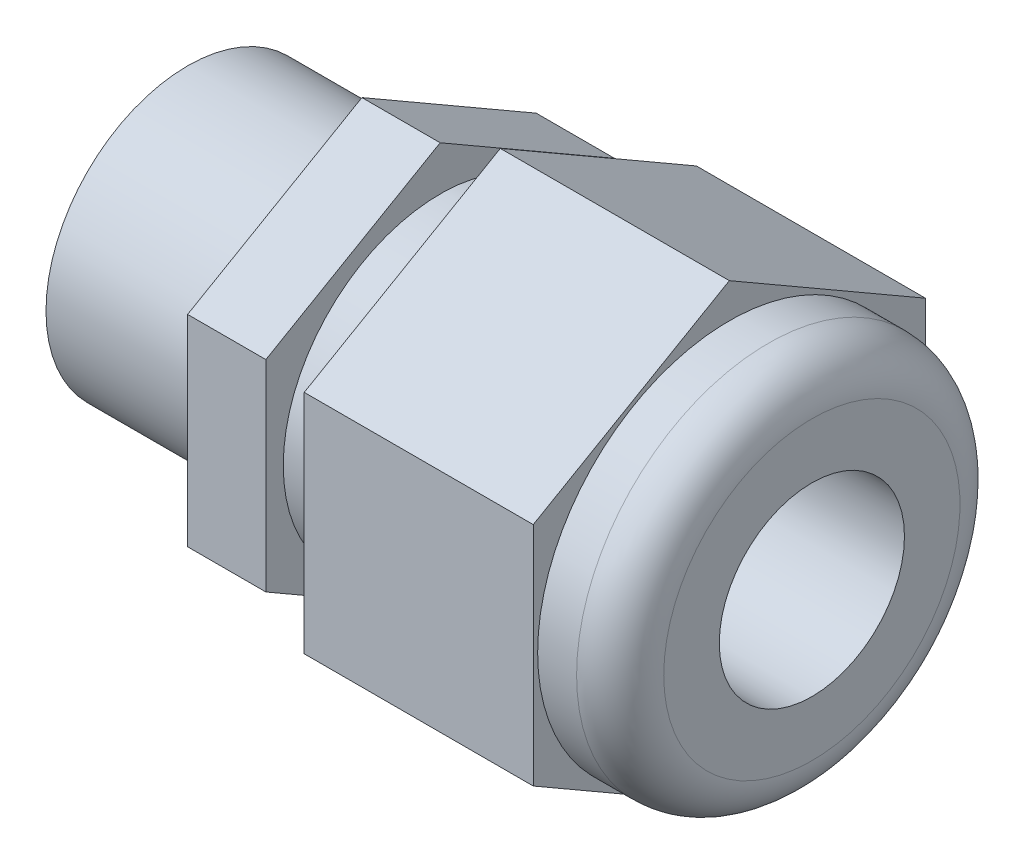
ISO-10303-21;
HEADER;
FILE_DESCRIPTION(('STEP AP214'),'2;1');
FILE_NAME('part.step','',(''),(''),'','','');
FILE_SCHEMA(('AUTOMOTIVE_DESIGN { 1 0 10303 214 1 1 1 1 }'));
ENDSEC;
DATA;
#1=APPLICATION_CONTEXT('core data for automotive mechanical design processes');
#2=APPLICATION_PROTOCOL_DEFINITION('international standard','automotive_design',2000,#1);
#3=PRODUCT_CONTEXT('',#1,'mechanical');
#4=PRODUCT('Part','Part','',(#3));
#5=PRODUCT_RELATED_PRODUCT_CATEGORY('part','',(#4));
#6=PRODUCT_DEFINITION_FORMATION('','',#4);
#7=PRODUCT_DEFINITION_CONTEXT('part definition',#1,'design');
#8=PRODUCT_DEFINITION('design','',#6,#7);
#9=PRODUCT_DEFINITION_SHAPE('','',#8);
#10=(LENGTH_UNIT() NAMED_UNIT(*) SI_UNIT(.MILLI.,.METRE.));
#11=(NAMED_UNIT(*) PLANE_ANGLE_UNIT() SI_UNIT($,.RADIAN.));
#12=(NAMED_UNIT(*) SI_UNIT($,.STERADIAN.) SOLID_ANGLE_UNIT());
#13=UNCERTAINTY_MEASURE_WITH_UNIT(LENGTH_MEASURE(1.E-05),#10,'distance_accuracy_value','');
#14=(GEOMETRIC_REPRESENTATION_CONTEXT(3) GLOBAL_UNCERTAINTY_ASSIGNED_CONTEXT((#13)) GLOBAL_UNIT_ASSIGNED_CONTEXT((#10,
#11,#12)) REPRESENTATION_CONTEXT('',''));
#15=CARTESIAN_POINT('',(0.,0.,0.));
#16=DIRECTION('',(0.,0.,1.));
#17=DIRECTION('',(1.,0.,0.));
#18=AXIS2_PLACEMENT_3D('',#15,#16,#17);
#19=CARTESIAN_POINT('',(11.5918104768105,7.20220565969389,0.));
#20=DIRECTION('',(-1.,0.,0.));
#21=DIRECTION('',(0.,0.,1.));
#22=AXIS2_PLACEMENT_3D('',#19,#20,#21);
#23=PLANE('',#22);
#24=CARTESIAN_POINT('',(11.5918104768105,0.,0.));
#25=DIRECTION('',(-1.,0.,0.));
#26=DIRECTION('',(0.,0.,1.));
#27=AXIS2_PLACEMENT_3D('',#24,#25,#26);
#28=CIRCLE('',#27,7.20220565969389);
#29=CARTESIAN_POINT('',(11.5918104768105,0.,7.20220565969389));
#30=VERTEX_POINT('',#29);
#31=EDGE_CURVE('E214',#30,#30,#28,.T.);
#32=ORIENTED_EDGE('',*,*,#31,.T.);
#33=EDGE_LOOP('',(#32));
#34=FACE_BOUND('',#33,.T.);
#35=DIRECTION('',(0.,0.5,-0.866025403784439));
#36=VECTOR('',#35,1.);
#37=CARTESIAN_POINT('',(11.5918104768105,8.72875464519898,0.881353467712515));
#38=LINE('',#37,#36);
#39=CARTESIAN_POINT('',(11.5918104768105,4.61880215351701,8.));
#40=VERTEX_POINT('',#39);
#41=CARTESIAN_POINT('',(11.5918104768105,9.23760430703402,0.));
#42=VERTEX_POINT('',#41);
#43=EDGE_CURVE('E175',#40,#42,#38,.T.);
#44=ORIENTED_EDGE('',*,*,#43,.F.);
#45=DIRECTION('',(0.,1.,0.));
#46=VECTOR('',#45,1.);
#47=CARTESIAN_POINT('',(11.5918104768105,7.20220565969389,8.));
#48=LINE('',#47,#46);
#49=CARTESIAN_POINT('',(11.5918104768105,-4.61880215351701,8.));
#50=VERTEX_POINT('',#49);
#51=EDGE_CURVE('E173',#50,#40,#48,.T.);
#52=ORIENTED_EDGE('',*,*,#51,.F.);
#53=DIRECTION('',(0.,0.5,0.866025403784439));
#54=VECTOR('',#53,1.);
#55=CARTESIAN_POINT('',(11.5918104768105,-5.12765181535204,7.11864653228749));
#56=LINE('',#55,#54);
#57=CARTESIAN_POINT('',(11.5918104768105,-9.23760430703401,0.));
#58=VERTEX_POINT('',#57);
#59=EDGE_CURVE('E171',#58,#50,#56,.T.);
#60=ORIENTED_EDGE('',*,*,#59,.F.);
#61=DIRECTION('',(0.,-0.5,0.866025403784439));
#62=VECTOR('',#61,1.);
#63=CARTESIAN_POINT('',(11.5918104768105,-5.12765181535203,-7.11864653228748));
#64=LINE('',#63,#62);
#65=CARTESIAN_POINT('',(11.5918104768105,-4.618802153517,-8.));
#66=VERTEX_POINT('',#65);
#67=EDGE_CURVE('E169',#66,#58,#64,.T.);
#68=ORIENTED_EDGE('',*,*,#67,.F.);
#69=DIRECTION('',(0.,-1.,0.));
#70=VECTOR('',#69,1.);
#71=CARTESIAN_POINT('',(11.5918104768105,7.20220565969389,-8.));
#72=LINE('',#71,#70);
#73=CARTESIAN_POINT('',(11.5918104768105,4.61880215351701,-8.));
#74=VERTEX_POINT('',#73);
#75=EDGE_CURVE('E131',#74,#66,#72,.T.);
#76=ORIENTED_EDGE('',*,*,#75,.F.);
#77=DIRECTION('',(0.,-0.5,-0.866025403784439));
#78=VECTOR('',#77,1.);
#79=CARTESIAN_POINT('',(11.5918104768105,8.72875464519898,-0.881353467712514));
#80=LINE('',#79,#78);
#81=EDGE_CURVE('E161',#42,#74,#80,.T.);
#82=ORIENTED_EDGE('',*,*,#81,.F.);
#83=EDGE_LOOP('',(#44,#52,#60,#68,#76,#82));
#84=FACE_BOUND('',#83,.T.);
#85=ADVANCED_FACE('F39',(#34,#84),#23,.F.);
#86=CARTESIAN_POINT('',(8.,10.,0.));
#87=DIRECTION('',(1.,0.,0.));
#88=DIRECTION('',(0.,0.,-1.));
#89=AXIS2_PLACEMENT_3D('',#86,#87,#88);
#90=PLANE('',#89);
#91=CARTESIAN_POINT('',(8.,0.,0.));
#92=DIRECTION('',(-1.,0.,0.));
#93=DIRECTION('',(0.,0.,1.));
#94=AXIS2_PLACEMENT_3D('',#91,#92,#93);
#95=CIRCLE('',#94,6.5);
#96=CARTESIAN_POINT('',(8.,0.,6.5));
#97=VERTEX_POINT('',#96);
#98=EDGE_CURVE('E211',#97,#97,#95,.T.);
#99=ORIENTED_EDGE('',*,*,#98,.F.);
#100=EDGE_LOOP('',(#99));
#101=FACE_BOUND('',#100,.T.);
#102=DIRECTION('',(0.,0.5,-0.866025403784439));
#103=VECTOR('',#102,1.);
#104=CARTESIAN_POINT('',(8.,4.61880215351701,8.));
#105=LINE('',#104,#103);
#106=CARTESIAN_POINT('',(8.,4.61880215351701,8.));
#107=VERTEX_POINT('',#106);
#108=CARTESIAN_POINT('',(8.,9.23760430703401,0.));
#109=VERTEX_POINT('',#108);
#110=EDGE_CURVE('E151',#107,#109,#105,.T.);
#111=ORIENTED_EDGE('',*,*,#110,.T.);
#112=DIRECTION('',(0.,-0.5,-0.866025403784439));
#113=VECTOR('',#112,1.);
#114=CARTESIAN_POINT('',(8.,9.23760430703402,0.));
#115=LINE('',#114,#113);
#116=CARTESIAN_POINT('',(8.,4.61880215351701,-8.));
#117=VERTEX_POINT('',#116);
#118=EDGE_CURVE('E149',#109,#117,#115,.T.);
#119=ORIENTED_EDGE('',*,*,#118,.T.);
#120=DIRECTION('',(0.,-1.,0.));
#121=VECTOR('',#120,1.);
#122=CARTESIAN_POINT('',(8.,4.61880215351701,-8.));
#123=LINE('',#122,#121);
#124=CARTESIAN_POINT('',(8.,-4.618802153517,-8.));
#125=VERTEX_POINT('',#124);
#126=EDGE_CURVE('E62',#117,#125,#123,.T.);
#127=ORIENTED_EDGE('',*,*,#126,.T.);
#128=DIRECTION('',(0.,-0.5,0.866025403784439));
#129=VECTOR('',#128,1.);
#130=CARTESIAN_POINT('',(8.,-4.618802153517,-8.));
#131=LINE('',#130,#129);
#132=CARTESIAN_POINT('',(8.,-9.23760430703401,0.));
#133=VERTEX_POINT('',#132);
#134=EDGE_CURVE('E138',#125,#133,#131,.T.);
#135=ORIENTED_EDGE('',*,*,#134,.T.);
#136=DIRECTION('',(0.,0.5,0.866025403784439));
#137=VECTOR('',#136,1.);
#138=CARTESIAN_POINT('',(8.,-9.23760430703401,0.));
#139=LINE('',#138,#137);
#140=CARTESIAN_POINT('',(8.,-4.61880215351701,8.));
#141=VERTEX_POINT('',#140);
#142=EDGE_CURVE('E144',#133,#141,#139,.T.);
#143=ORIENTED_EDGE('',*,*,#142,.T.);
#144=DIRECTION('',(0.,1.,0.));
#145=VECTOR('',#144,1.);
#146=CARTESIAN_POINT('',(8.,-4.61880215351701,8.));
#147=LINE('',#146,#145);
#148=EDGE_CURVE('E156',#141,#107,#147,.T.);
#149=ORIENTED_EDGE('',*,*,#148,.T.);
#150=EDGE_LOOP('',(#111,#119,#127,#135,#143,#149));
#151=FACE_BOUND('',#150,.T.);
#152=ADVANCED_FACE('F148',(#101,#151),#90,.F.);
#153=CARTESIAN_POINT('',(24.8644432748101,8.79866584697549,0.));
#154=DIRECTION('',(-1.,0.,0.));
#155=DIRECTION('',(0.,0.,1.));
#156=AXIS2_PLACEMENT_3D('',#153,#154,#155);
#157=PLANE('',#156);
#158=CARTESIAN_POINT('',(24.8644432748101,0.,0.));
#159=DIRECTION('',(-1.,0.,0.));
#160=DIRECTION('',(0.,0.,1.));
#161=AXIS2_PLACEMENT_3D('',#158,#159,#160);
#162=CIRCLE('',#161,8.79866584697549);
#163=CARTESIAN_POINT('',(24.8644432748101,0.,8.79866584697549));
#164=VERTEX_POINT('',#163);
#165=EDGE_CURVE('E220',#164,#164,#162,.T.);
#166=ORIENTED_EDGE('',*,*,#165,.T.);
#167=EDGE_LOOP('',(#166));
#168=FACE_BOUND('',#167,.T.);
#169=DIRECTION('',(0.,0.5,0.866025403784439));
#170=VECTOR('',#169,1.);
#171=CARTESIAN_POINT('',(24.8644432748101,5.19615242270664,-9.));
#172=LINE('',#171,#170);
#173=CARTESIAN_POINT('',(24.8644432748101,5.19615242270664,-9.));
#174=VERTEX_POINT('',#173);
#175=CARTESIAN_POINT('',(24.8644432748101,10.3923048454133,0.));
#176=VERTEX_POINT('',#175);
#177=EDGE_CURVE('E177',#174,#176,#172,.T.);
#178=ORIENTED_EDGE('',*,*,#177,.T.);
#179=DIRECTION('',(0.,-0.5,0.866025403784439));
#180=VECTOR('',#179,1.);
#181=CARTESIAN_POINT('',(24.8644432748101,10.3923048454133,0.));
#182=LINE('',#181,#180);
#183=CARTESIAN_POINT('',(24.8644432748101,5.19615242270663,9.));
#184=VERTEX_POINT('',#183);
#185=EDGE_CURVE('E180',#176,#184,#182,.T.);
#186=ORIENTED_EDGE('',*,*,#185,.T.);
#187=DIRECTION('',(0.,-1.,0.));
#188=VECTOR('',#187,1.);
#189=CARTESIAN_POINT('',(24.8644432748101,5.19615242270663,9.));
#190=LINE('',#189,#188);
#191=CARTESIAN_POINT('',(24.8644432748101,-5.19615242270663,9.));
#192=VERTEX_POINT('',#191);
#193=EDGE_CURVE('E183',#184,#192,#190,.T.);
#194=ORIENTED_EDGE('',*,*,#193,.T.);
#195=DIRECTION('',(0.,-0.5,-0.866025403784439));
#196=VECTOR('',#195,1.);
#197=CARTESIAN_POINT('',(24.8644432748101,-5.19615242270663,9.));
#198=LINE('',#197,#196);
#199=CARTESIAN_POINT('',(24.8644432748101,-10.3923048454133,0.));
#200=VERTEX_POINT('',#199);
#201=EDGE_CURVE('E186',#192,#200,#198,.T.);
#202=ORIENTED_EDGE('',*,*,#201,.T.);
#203=DIRECTION('',(0.,0.5,-0.866025403784439));
#204=VECTOR('',#203,1.);
#205=CARTESIAN_POINT('',(24.8644432748101,-10.3923048454133,0.));
#206=LINE('',#205,#204);
#207=CARTESIAN_POINT('',(24.8644432748101,-5.19615242270663,-9.));
#208=VERTEX_POINT('',#207);
#209=EDGE_CURVE('E189',#200,#208,#206,.T.);
#210=ORIENTED_EDGE('',*,*,#209,.T.);
#211=DIRECTION('',(0.,1.,0.));
#212=VECTOR('',#211,1.);
#213=CARTESIAN_POINT('',(24.8644432748101,-5.19615242270663,-9.));
#214=LINE('',#213,#212);
#215=EDGE_CURVE('E192',#208,#174,#214,.T.);
#216=ORIENTED_EDGE('',*,*,#215,.T.);
#217=EDGE_LOOP('',(#178,#186,#194,#202,#210,#216));
#218=FACE_BOUND('',#217,.T.);
#219=ADVANCED_FACE('F263',(#168,#218),#157,.F.);
#220=CARTESIAN_POINT('',(14.3525060344133,11.,0.));
#221=DIRECTION('',(1.,0.,0.));
#222=DIRECTION('',(0.,0.,-1.));
#223=AXIS2_PLACEMENT_3D('',#220,#221,#222);
#224=PLANE('',#223);
#225=CARTESIAN_POINT('',(14.3525060344133,0.,0.));
#226=DIRECTION('',(-1.,0.,0.));
#227=DIRECTION('',(0.,0.,1.));
#228=AXIS2_PLACEMENT_3D('',#225,#226,#227);
#229=CIRCLE('',#228,7.20220565969389);
#230=CARTESIAN_POINT('',(14.3525060344133,0.,7.20220565969389));
#231=VERTEX_POINT('',#230);
#232=EDGE_CURVE('E217',#231,#231,#229,.T.);
#233=ORIENTED_EDGE('',*,*,#232,.F.);
#234=EDGE_LOOP('',(#233));
#235=FACE_BOUND('',#234,.T.);
#236=DIRECTION('',(0.,0.5,0.866025403784439));
#237=VECTOR('',#236,1.);
#238=CARTESIAN_POINT('',(14.3525060344133,10.5442286340599,0.263139720814412));
#239=LINE('',#238,#237);
#240=CARTESIAN_POINT('',(14.3525060344133,5.19615242270664,-9.));
#241=VERTEX_POINT('',#240);
#242=CARTESIAN_POINT('',(14.3525060344133,10.3923048454133,0.));
#243=VERTEX_POINT('',#242);
#244=EDGE_CURVE('E239',#241,#243,#239,.T.);
#245=ORIENTED_EDGE('',*,*,#244,.F.);
#246=DIRECTION('',(0.,1.,0.));
#247=VECTOR('',#246,1.);
#248=CARTESIAN_POINT('',(14.3525060344133,11.,-9.));
#249=LINE('',#248,#247);
#250=CARTESIAN_POINT('',(14.3525060344133,-5.19615242270663,-9.));
#251=VERTEX_POINT('',#250);
#252=EDGE_CURVE('E237',#251,#241,#249,.T.);
#253=ORIENTED_EDGE('',*,*,#252,.F.);
#254=DIRECTION('',(0.,0.5,-0.866025403784439));
#255=VECTOR('',#254,1.);
#256=CARTESIAN_POINT('',(14.3525060344133,-5.04422863405995,-9.26313972081441));
#257=LINE('',#256,#255);
#258=CARTESIAN_POINT('',(14.3525060344133,-10.3923048454133,0.));
#259=VERTEX_POINT('',#258);
#260=EDGE_CURVE('E235',#259,#251,#257,.T.);
#261=ORIENTED_EDGE('',*,*,#260,.F.);
#262=DIRECTION('',(0.,-0.5,-0.866025403784439));
#263=VECTOR('',#262,1.);
#264=CARTESIAN_POINT('',(14.3525060344133,-5.04422863405995,9.26313972081441));
#265=LINE('',#264,#263);
#266=CARTESIAN_POINT('',(14.3525060344133,-5.19615242270663,9.));
#267=VERTEX_POINT('',#266);
#268=EDGE_CURVE('E233',#267,#259,#265,.T.);
#269=ORIENTED_EDGE('',*,*,#268,.F.);
#270=DIRECTION('',(0.,-1.,0.));
#271=VECTOR('',#270,1.);
#272=CARTESIAN_POINT('',(14.3525060344133,11.,9.));
#273=LINE('',#272,#271);
#274=CARTESIAN_POINT('',(14.3525060344133,5.19615242270663,9.));
#275=VERTEX_POINT('',#274);
#276=EDGE_CURVE('E231',#275,#267,#273,.T.);
#277=ORIENTED_EDGE('',*,*,#276,.F.);
#278=DIRECTION('',(0.,-0.5,0.866025403784439));
#279=VECTOR('',#278,1.);
#280=CARTESIAN_POINT('',(14.3525060344133,10.5442286340599,-0.263139720814412));
#281=LINE('',#280,#279);
#282=EDGE_CURVE('E229',#243,#275,#281,.T.);
#283=ORIENTED_EDGE('',*,*,#282,.F.);
#284=EDGE_LOOP('',(#245,#253,#261,#269,#277,#283));
#285=FACE_BOUND('',#284,.T.);
#286=ADVANCED_FACE('F274',(#235,#285),#224,.F.);
#287=CARTESIAN_POINT('',(0.,6.5,0.));
#288=DIRECTION('',(1.,0.,0.));
#289=DIRECTION('',(0.,0.,-1.));
#290=AXIS2_PLACEMENT_3D('',#287,#288,#289);
#291=PLANE('',#290);
#292=CARTESIAN_POINT('',(0.,0.,0.));
#293=DIRECTION('',(-1.,0.,0.));
#294=DIRECTION('',(0.,0.,1.));
#295=AXIS2_PLACEMENT_3D('',#292,#293,#294);
#296=CIRCLE('',#295,4.25);
#297=CARTESIAN_POINT('',(0.,0.,4.25));
#298=VERTEX_POINT('',#297);
#299=EDGE_CURVE('E226',#298,#298,#296,.T.);
#300=ORIENTED_EDGE('',*,*,#299,.F.);
#301=EDGE_LOOP('',(#300));
#302=FACE_BOUND('',#301,.T.);
#303=CARTESIAN_POINT('',(0.,0.,0.));
#304=DIRECTION('',(-1.,0.,0.));
#305=DIRECTION('',(0.,0.,1.));
#306=AXIS2_PLACEMENT_3D('',#303,#304,#305);
#307=CIRCLE('',#306,6.5);
#308=CARTESIAN_POINT('',(0.,0.,6.5));
#309=VERTEX_POINT('',#308);
#310=EDGE_CURVE('E198',#309,#309,#307,.T.);
#311=ORIENTED_EDGE('',*,*,#310,.T.);
#312=EDGE_LOOP('',(#311));
#313=FACE_BOUND('',#312,.T.);
#314=ADVANCED_FACE('F277',(#302,#313),#291,.F.);
#315=CARTESIAN_POINT('',(0.,0.,0.));
#316=DIRECTION('',(-1.,0.,0.));
#317=DIRECTION('',(0.,0.,1.));
#318=AXIS2_PLACEMENT_3D('',#315,#316,#317);
#319=CYLINDRICAL_SURFACE('',#318,4.25);
#320=CARTESIAN_POINT('',(28.6525060344133,0.,0.));
#321=DIRECTION('',(-1.,0.,0.));
#322=DIRECTION('',(0.,0.,1.));
#323=AXIS2_PLACEMENT_3D('',#320,#321,#322);
#324=CIRCLE('',#323,4.25);
#325=CARTESIAN_POINT('',(28.6525060344133,0.,4.25));
#326=VERTEX_POINT('',#325);
#327=EDGE_CURVE('E223',#326,#326,#324,.T.);
#328=ORIENTED_EDGE('',*,*,#327,.F.);
#329=EDGE_LOOP('',(#328));
#330=FACE_BOUND('',#329,.T.);
#331=ORIENTED_EDGE('',*,*,#299,.T.);
#332=EDGE_LOOP('',(#331));
#333=FACE_BOUND('',#332,.T.);
#334=ADVANCED_FACE('F286',(#330,#333),#319,.F.);
#335=CARTESIAN_POINT('',(28.6525060344133,4.25,0.));
#336=DIRECTION('',(-1.,0.,0.));
#337=DIRECTION('',(0.,0.,1.));
#338=AXIS2_PLACEMENT_3D('',#335,#336,#337);
#339=PLANE('',#338);
#340=CARTESIAN_POINT('',(28.6525060344133,0.,0.));
#341=DIRECTION('',(-1.,0.,0.));
#342=DIRECTION('',(0.,0.,1.));
#343=AXIS2_PLACEMENT_3D('',#340,#341,#342);
#344=CIRCLE('',#343,6.79866584697549);
#345=CARTESIAN_POINT('',(28.6525060344133,0.,6.79866584697549));
#346=VERTEX_POINT('',#345);
#347=EDGE_CURVE('E11',#346,#346,#344,.F.);
#348=ORIENTED_EDGE('',*,*,#347,.T.);
#349=EDGE_LOOP('',(#348));
#350=FACE_BOUND('',#349,.T.);
#351=ORIENTED_EDGE('',*,*,#327,.T.);
#352=EDGE_LOOP('',(#351));
#353=FACE_BOUND('',#352,.T.);
#354=ADVANCED_FACE('F283',(#350,#353),#339,.F.);
#355=CARTESIAN_POINT('',(0.,0.,0.));
#356=DIRECTION('',(-1.,0.,0.));
#357=DIRECTION('',(0.,0.,1.));
#358=AXIS2_PLACEMENT_3D('',#355,#356,#357);
#359=CYLINDRICAL_SURFACE('',#358,8.79866584697549);
#360=CARTESIAN_POINT('',(26.6525060344133,0.,0.));
#361=DIRECTION('',(-1.,0.,0.));
#362=DIRECTION('',(0.,0.,1.));
#363=AXIS2_PLACEMENT_3D('',#360,#361,#362);
#364=CIRCLE('',#363,8.79866584697549);
#365=CARTESIAN_POINT('',(26.6525060344133,0.,8.79866584697549));
#366=VERTEX_POINT('',#365);
#367=EDGE_CURVE('E47',#366,#366,#364,.T.);
#368=ORIENTED_EDGE('',*,*,#367,.T.);
#369=EDGE_LOOP('',(#368));
#370=FACE_BOUND('',#369,.T.);
#371=ORIENTED_EDGE('',*,*,#165,.F.);
#372=EDGE_LOOP('',(#371));
#373=FACE_BOUND('',#372,.T.);
#374=ADVANCED_FACE('F244',(#370,#373),#359,.T.);
#375=CARTESIAN_POINT('',(0.,0.,0.));
#376=DIRECTION('',(-1.,0.,0.));
#377=DIRECTION('',(0.,0.,1.));
#378=AXIS2_PLACEMENT_3D('',#375,#376,#377);
#379=CYLINDRICAL_SURFACE('',#378,7.20220565969389);
#380=ORIENTED_EDGE('',*,*,#31,.F.);
#381=EDGE_LOOP('',(#380));
#382=FACE_BOUND('',#381,.T.);
#383=ORIENTED_EDGE('',*,*,#232,.T.);
#384=EDGE_LOOP('',(#383));
#385=FACE_BOUND('',#384,.T.);
#386=ADVANCED_FACE('F269',(#382,#385),#379,.T.);
#387=CARTESIAN_POINT('',(0.,0.,0.));
#388=DIRECTION('',(-1.,0.,0.));
#389=DIRECTION('',(0.,0.,1.));
#390=AXIS2_PLACEMENT_3D('',#387,#388,#389);
#391=CYLINDRICAL_SURFACE('',#390,6.5);
#392=ORIENTED_EDGE('',*,*,#310,.F.);
#393=EDGE_LOOP('',(#392));
#394=FACE_BOUND('',#393,.T.);
#395=ORIENTED_EDGE('',*,*,#98,.T.);
#396=EDGE_LOOP('',(#395));
#397=FACE_BOUND('',#396,.T.);
#398=ADVANCED_FACE('F272',(#394,#397),#391,.T.);
#399=CARTESIAN_POINT('',(12.8644432748101,5.19615242270664,-9.));
#400=DIRECTION('',(0.,0.866025403784439,-0.5));
#401=DIRECTION('',(0.,0.5,0.866025403784439));
#402=AXIS2_PLACEMENT_3D('',#399,#400,#401);
#403=PLANE('',#402);
#404=ORIENTED_EDGE('',*,*,#244,.T.);
#405=DIRECTION('',(1.,0.,0.));
#406=VECTOR('',#405,1.);
#407=CARTESIAN_POINT('',(12.8644432748101,10.3923048454133,0.));
#408=LINE('',#407,#406);
#409=EDGE_CURVE('E195',#243,#176,#408,.T.);
#410=ORIENTED_EDGE('',*,*,#409,.T.);
#411=ORIENTED_EDGE('',*,*,#177,.F.);
#412=DIRECTION('',(1.,0.,0.));
#413=VECTOR('',#412,1.);
#414=CARTESIAN_POINT('',(12.8644432748101,5.19615242270664,-9.));
#415=LINE('',#414,#413);
#416=EDGE_CURVE('E196',#241,#174,#415,.T.);
#417=ORIENTED_EDGE('',*,*,#416,.F.);
#418=EDGE_LOOP('',(#404,#410,#411,#417));
#419=FACE_BOUND('',#418,.T.);
#420=ADVANCED_FACE('F300',(#419),#403,.T.);
#421=CARTESIAN_POINT('',(12.8644432748101,-5.19615242270663,-9.));
#422=DIRECTION('',(0.,0.,-1.));
#423=DIRECTION('',(0.,1.,0.));
#424=AXIS2_PLACEMENT_3D('',#421,#422,#423);
#425=PLANE('',#424);
#426=ORIENTED_EDGE('',*,*,#252,.T.);
#427=ORIENTED_EDGE('',*,*,#416,.T.);
#428=ORIENTED_EDGE('',*,*,#215,.F.);
#429=DIRECTION('',(1.,0.,0.));
#430=VECTOR('',#429,1.);
#431=CARTESIAN_POINT('',(12.8644432748101,-5.19615242270663,-9.));
#432=LINE('',#431,#430);
#433=EDGE_CURVE('E199',#251,#208,#432,.T.);
#434=ORIENTED_EDGE('',*,*,#433,.F.);
#435=EDGE_LOOP('',(#426,#427,#428,#434));
#436=FACE_BOUND('',#435,.T.);
#437=ADVANCED_FACE('F305',(#436),#425,.T.);
#438=CARTESIAN_POINT('',(12.8644432748101,-10.3923048454133,0.));
#439=DIRECTION('',(0.,-0.866025403784439,-0.5));
#440=DIRECTION('',(0.,0.5,-0.866025403784439));
#441=AXIS2_PLACEMENT_3D('',#438,#439,#440);
#442=PLANE('',#441);
#443=ORIENTED_EDGE('',*,*,#260,.T.);
#444=ORIENTED_EDGE('',*,*,#433,.T.);
#445=ORIENTED_EDGE('',*,*,#209,.F.);
#446=DIRECTION('',(1.,0.,0.));
#447=VECTOR('',#446,1.);
#448=CARTESIAN_POINT('',(12.8644432748101,-10.3923048454133,0.));
#449=LINE('',#448,#447);
#450=EDGE_CURVE('E201',#259,#200,#449,.T.);
#451=ORIENTED_EDGE('',*,*,#450,.F.);
#452=EDGE_LOOP('',(#443,#444,#445,#451));
#453=FACE_BOUND('',#452,.T.);
#454=ADVANCED_FACE('F320',(#453),#442,.T.);
#455=CARTESIAN_POINT('',(12.8644432748101,-5.19615242270663,9.));
#456=DIRECTION('',(0.,-0.866025403784439,0.5));
#457=DIRECTION('',(0.,-0.5,-0.866025403784439));
#458=AXIS2_PLACEMENT_3D('',#455,#456,#457);
#459=PLANE('',#458);
#460=ORIENTED_EDGE('',*,*,#268,.T.);
#461=ORIENTED_EDGE('',*,*,#450,.T.);
#462=ORIENTED_EDGE('',*,*,#201,.F.);
#463=DIRECTION('',(1.,0.,0.));
#464=VECTOR('',#463,1.);
#465=CARTESIAN_POINT('',(12.8644432748101,-5.19615242270663,9.));
#466=LINE('',#465,#464);
#467=EDGE_CURVE('E203',#267,#192,#466,.T.);
#468=ORIENTED_EDGE('',*,*,#467,.F.);
#469=EDGE_LOOP('',(#460,#461,#462,#468));
#470=FACE_BOUND('',#469,.T.);
#471=ADVANCED_FACE('F316',(#470),#459,.T.);
#472=CARTESIAN_POINT('',(12.8644432748101,5.19615242270663,9.));
#473=DIRECTION('',(0.,0.,1.));
#474=DIRECTION('',(1.,0.,0.));
#475=AXIS2_PLACEMENT_3D('',#472,#473,#474);
#476=PLANE('',#475);
#477=ORIENTED_EDGE('',*,*,#276,.T.);
#478=ORIENTED_EDGE('',*,*,#467,.T.);
#479=ORIENTED_EDGE('',*,*,#193,.F.);
#480=DIRECTION('',(1.,0.,0.));
#481=VECTOR('',#480,1.);
#482=CARTESIAN_POINT('',(12.8644432748101,5.19615242270663,9.));
#483=LINE('',#482,#481);
#484=EDGE_CURVE('E205',#275,#184,#483,.T.);
#485=ORIENTED_EDGE('',*,*,#484,.F.);
#486=EDGE_LOOP('',(#477,#478,#479,#485));
#487=FACE_BOUND('',#486,.T.);
#488=ADVANCED_FACE('F312',(#487),#476,.T.);
#489=CARTESIAN_POINT('',(12.8644432748101,10.3923048454133,0.));
#490=DIRECTION('',(0.,0.866025403784439,0.5));
#491=DIRECTION('',(0.,-0.5,0.866025403784439));
#492=AXIS2_PLACEMENT_3D('',#489,#490,#491);
#493=PLANE('',#492);
#494=ORIENTED_EDGE('',*,*,#282,.T.);
#495=ORIENTED_EDGE('',*,*,#484,.T.);
#496=ORIENTED_EDGE('',*,*,#185,.F.);
#497=ORIENTED_EDGE('',*,*,#409,.F.);
#498=EDGE_LOOP('',(#494,#495,#496,#497));
#499=FACE_BOUND('',#498,.T.);
#500=ADVANCED_FACE('F309',(#499),#493,.T.);
#501=CARTESIAN_POINT('',(13.,4.61880215351701,8.));
#502=DIRECTION('',(0.,0.866025403784439,0.5));
#503=DIRECTION('',(0.,-0.5,0.866025403784439));
#504=AXIS2_PLACEMENT_3D('',#501,#502,#503);
#505=PLANE('',#504);
#506=ORIENTED_EDGE('',*,*,#43,.T.);
#507=DIRECTION('',(-1.,0.,0.));
#508=VECTOR('',#507,1.);
#509=CARTESIAN_POINT('',(13.,9.23760430703402,0.));
#510=LINE('',#509,#508);
#511=EDGE_CURVE('E54',#42,#109,#510,.T.);
#512=ORIENTED_EDGE('',*,*,#511,.T.);
#513=ORIENTED_EDGE('',*,*,#110,.F.);
#514=DIRECTION('',(-1.,0.,0.));
#515=VECTOR('',#514,1.);
#516=CARTESIAN_POINT('',(13.,4.61880215351701,8.));
#517=LINE('',#516,#515);
#518=EDGE_CURVE('E159',#40,#107,#517,.T.);
#519=ORIENTED_EDGE('',*,*,#518,.F.);
#520=EDGE_LOOP('',(#506,#512,#513,#519));
#521=FACE_BOUND('',#520,.T.);
#522=ADVANCED_FACE('F311',(#521),#505,.T.);
#523=CARTESIAN_POINT('',(13.,-4.61880215351701,8.));
#524=DIRECTION('',(0.,0.,1.));
#525=DIRECTION('',(0.,-1.,0.));
#526=AXIS2_PLACEMENT_3D('',#523,#524,#525);
#527=PLANE('',#526);
#528=ORIENTED_EDGE('',*,*,#51,.T.);
#529=ORIENTED_EDGE('',*,*,#518,.T.);
#530=ORIENTED_EDGE('',*,*,#148,.F.);
#531=DIRECTION('',(-1.,0.,0.));
#532=VECTOR('',#531,1.);
#533=CARTESIAN_POINT('',(13.,-4.61880215351701,8.));
#534=LINE('',#533,#532);
#535=EDGE_CURVE('E162',#50,#141,#534,.T.);
#536=ORIENTED_EDGE('',*,*,#535,.F.);
#537=EDGE_LOOP('',(#528,#529,#530,#536));
#538=FACE_BOUND('',#537,.T.);
#539=ADVANCED_FACE('F329',(#538),#527,.T.);
#540=CARTESIAN_POINT('',(13.,-9.23760430703401,0.));
#541=DIRECTION('',(0.,-0.866025403784439,0.5));
#542=DIRECTION('',(0.,-0.5,-0.866025403784439));
#543=AXIS2_PLACEMENT_3D('',#540,#541,#542);
#544=PLANE('',#543);
#545=ORIENTED_EDGE('',*,*,#59,.T.);
#546=ORIENTED_EDGE('',*,*,#535,.T.);
#547=ORIENTED_EDGE('',*,*,#142,.F.);
#548=DIRECTION('',(-1.,0.,0.));
#549=VECTOR('',#548,1.);
#550=CARTESIAN_POINT('',(13.,-9.23760430703401,0.));
#551=LINE('',#550,#549);
#552=EDGE_CURVE('E134',#58,#133,#551,.T.);
#553=ORIENTED_EDGE('',*,*,#552,.F.);
#554=EDGE_LOOP('',(#545,#546,#547,#553));
#555=FACE_BOUND('',#554,.T.);
#556=ADVANCED_FACE('F336',(#555),#544,.T.);
#557=CARTESIAN_POINT('',(13.,-4.618802153517,-8.));
#558=DIRECTION('',(0.,-0.866025403784439,-0.5));
#559=DIRECTION('',(0.,0.5,-0.866025403784439));
#560=AXIS2_PLACEMENT_3D('',#557,#558,#559);
#561=PLANE('',#560);
#562=ORIENTED_EDGE('',*,*,#67,.T.);
#563=ORIENTED_EDGE('',*,*,#552,.T.);
#564=ORIENTED_EDGE('',*,*,#134,.F.);
#565=DIRECTION('',(-1.,0.,0.));
#566=VECTOR('',#565,1.);
#567=CARTESIAN_POINT('',(13.,-4.618802153517,-8.));
#568=LINE('',#567,#566);
#569=EDGE_CURVE('E127',#66,#125,#568,.T.);
#570=ORIENTED_EDGE('',*,*,#569,.F.);
#571=EDGE_LOOP('',(#562,#563,#564,#570));
#572=FACE_BOUND('',#571,.T.);
#573=ADVANCED_FACE('F139',(#572),#561,.T.);
#574=CARTESIAN_POINT('',(13.,4.61880215351701,-8.));
#575=DIRECTION('',(0.,0.,-1.));
#576=DIRECTION('',(0.,1.,0.));
#577=AXIS2_PLACEMENT_3D('',#574,#575,#576);
#578=PLANE('',#577);
#579=ORIENTED_EDGE('',*,*,#75,.T.);
#580=ORIENTED_EDGE('',*,*,#569,.T.);
#581=ORIENTED_EDGE('',*,*,#126,.F.);
#582=DIRECTION('',(-1.,0.,0.));
#583=VECTOR('',#582,1.);
#584=CARTESIAN_POINT('',(13.,4.61880215351701,-8.));
#585=LINE('',#584,#583);
#586=EDGE_CURVE('E135',#74,#117,#585,.T.);
#587=ORIENTED_EDGE('',*,*,#586,.F.);
#588=EDGE_LOOP('',(#579,#580,#581,#587));
#589=FACE_BOUND('',#588,.T.);
#590=ADVANCED_FACE('F129',(#589),#578,.T.);
#591=CARTESIAN_POINT('',(13.,9.23760430703402,0.));
#592=DIRECTION('',(0.,0.866025403784439,-0.5));
#593=DIRECTION('',(0.,0.5,0.866025403784439));
#594=AXIS2_PLACEMENT_3D('',#591,#592,#593);
#595=PLANE('',#594);
#596=ORIENTED_EDGE('',*,*,#81,.T.);
#597=ORIENTED_EDGE('',*,*,#586,.T.);
#598=ORIENTED_EDGE('',*,*,#118,.F.);
#599=ORIENTED_EDGE('',*,*,#511,.F.);
#600=EDGE_LOOP('',(#596,#597,#598,#599));
#601=FACE_BOUND('',#600,.T.);
#602=ADVANCED_FACE('F248',(#601),#595,.T.);
#603=CARTESIAN_POINT('',(26.6525060344133,0.,0.));
#604=DIRECTION('',(-1.,0.,0.));
#605=DIRECTION('',(0.,0.,1.));
#606=AXIS2_PLACEMENT_3D('',#603,#604,#605);
#607=TOROIDAL_SURFACE('',#606,6.79866584697549,2.);
#608=ORIENTED_EDGE('',*,*,#347,.F.);
#609=EDGE_LOOP('',(#608));
#610=FACE_BOUND('',#609,.T.);
#611=ORIENTED_EDGE('',*,*,#367,.F.);
#612=EDGE_LOOP('',(#611));
#613=FACE_BOUND('',#612,.T.);
#614=ADVANCED_FACE('F41',(#610,#613),#607,.T.);
#615=CLOSED_SHELL('',(#85,#152,#219,#286,#314,#334,#354,#374,#386,#398,#420,#437,#454,#471,#488,
#500,#522,#539,#556,#573,#590,#602,#614));
#616=MANIFOLD_SOLID_BREP('B2',#615);
#617=ADVANCED_BREP_SHAPE_REPRESENTATION('',(#18,#616),#14);
#618=SHAPE_DEFINITION_REPRESENTATION(#9,#617);
ENDSEC;
END-ISO-10303-21;
